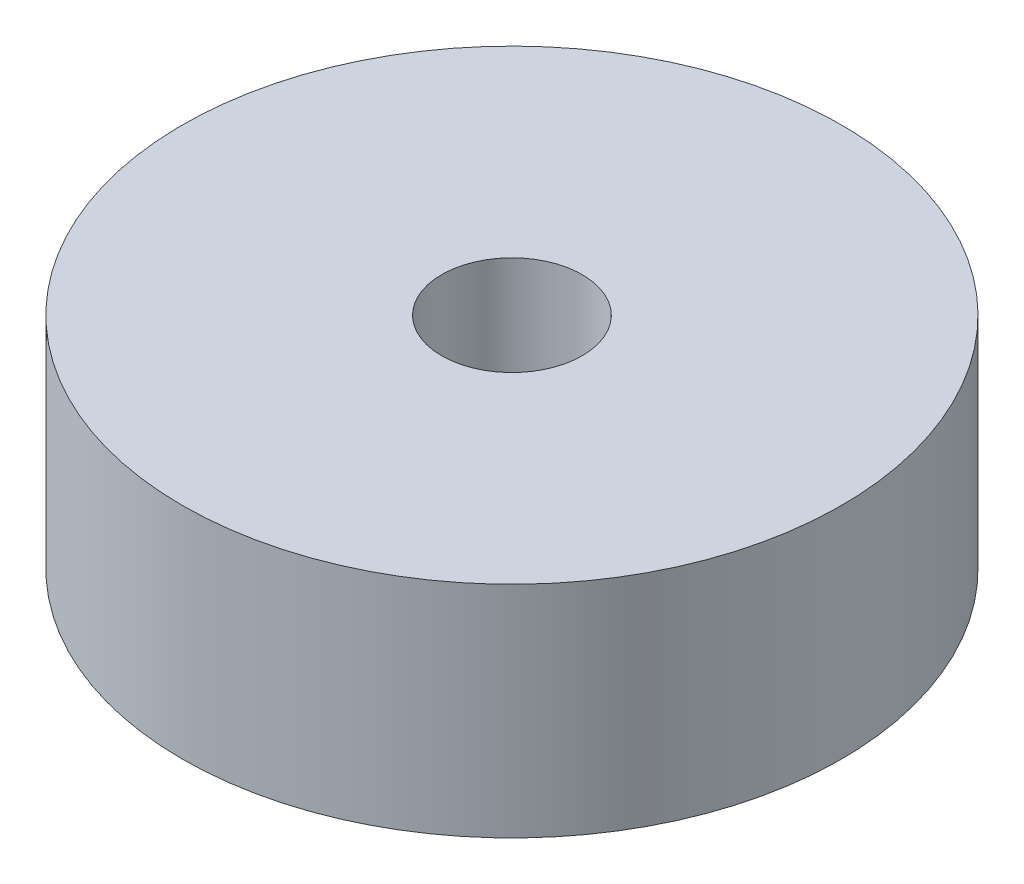
ISO-10303-21;
HEADER;
FILE_DESCRIPTION(('STEP AP214'),'2;1');
FILE_NAME('part.step','',(''),(''),'','','');
FILE_SCHEMA(('AUTOMOTIVE_DESIGN { 1 0 10303 214 1 1 1 1 }'));
ENDSEC;
DATA;
#1=APPLICATION_CONTEXT('core data for automotive mechanical design processes');
#2=APPLICATION_PROTOCOL_DEFINITION('international standard','automotive_design',2000,#1);
#3=PRODUCT_CONTEXT('',#1,'mechanical');
#4=PRODUCT('Part','Part','',(#3));
#5=PRODUCT_RELATED_PRODUCT_CATEGORY('part','',(#4));
#6=PRODUCT_DEFINITION_FORMATION('','',#4);
#7=PRODUCT_DEFINITION_CONTEXT('part definition',#1,'design');
#8=PRODUCT_DEFINITION('design','',#6,#7);
#9=PRODUCT_DEFINITION_SHAPE('','',#8);
#10=(LENGTH_UNIT() NAMED_UNIT(*) SI_UNIT(.MILLI.,.METRE.));
#11=(NAMED_UNIT(*) PLANE_ANGLE_UNIT() SI_UNIT($,.RADIAN.));
#12=(NAMED_UNIT(*) SI_UNIT($,.STERADIAN.) SOLID_ANGLE_UNIT());
#13=UNCERTAINTY_MEASURE_WITH_UNIT(LENGTH_MEASURE(1.E-05),#10,'distance_accuracy_value','');
#14=(GEOMETRIC_REPRESENTATION_CONTEXT(3) GLOBAL_UNCERTAINTY_ASSIGNED_CONTEXT((#13)) GLOBAL_UNIT_ASSIGNED_CONTEXT((#10,
#11,#12)) REPRESENTATION_CONTEXT('',''));
#15=CARTESIAN_POINT('',(0.,0.,0.));
#16=DIRECTION('',(0.,0.,1.));
#17=DIRECTION('',(1.,0.,0.));
#18=AXIS2_PLACEMENT_3D('',#15,#16,#17);
#19=CARTESIAN_POINT('',(0.,5.,0.));
#20=DIRECTION('',(0.,1.,0.));
#21=DIRECTION('',(0.,0.,1.));
#22=AXIS2_PLACEMENT_3D('',#19,#20,#21);
#23=PLANE('',#22);
#24=CARTESIAN_POINT('',(0.,5.,0.));
#25=DIRECTION('',(0.,1.,0.));
#26=DIRECTION('',(0.,0.,1.));
#27=AXIS2_PLACEMENT_3D('',#24,#25,#26);
#28=CIRCLE('',#27,7.5);
#29=CARTESIAN_POINT('',(0.,5.,7.5));
#30=VERTEX_POINT('',#29);
#31=EDGE_CURVE('E10',#30,#30,#28,.T.);
#32=ORIENTED_EDGE('',*,*,#31,.T.);
#33=EDGE_LOOP('',(#32));
#34=FACE_BOUND('',#33,.T.);
#35=CARTESIAN_POINT('',(0.,5.,0.));
#36=DIRECTION('',(0.,1.,0.));
#37=DIRECTION('',(0.,0.,1.));
#38=AXIS2_PLACEMENT_3D('',#35,#36,#37);
#39=CIRCLE('',#38,1.6);
#40=CARTESIAN_POINT('',(0.,5.,1.6));
#41=VERTEX_POINT('',#40);
#42=EDGE_CURVE('E44',#41,#41,#39,.T.);
#43=ORIENTED_EDGE('',*,*,#42,.F.);
#44=EDGE_LOOP('',(#43));
#45=FACE_BOUND('',#44,.T.);
#46=ADVANCED_FACE('F33',(#34,#45),#23,.T.);
#47=CARTESIAN_POINT('',(0.,0.,0.));
#48=DIRECTION('',(0.,1.,0.));
#49=DIRECTION('',(0.,0.,1.));
#50=AXIS2_PLACEMENT_3D('',#47,#48,#49);
#51=PLANE('',#50);
#52=CARTESIAN_POINT('',(0.,0.,0.));
#53=DIRECTION('',(0.,1.,0.));
#54=DIRECTION('',(0.,0.,1.));
#55=AXIS2_PLACEMENT_3D('',#52,#53,#54);
#56=CIRCLE('',#55,7.5);
#57=CARTESIAN_POINT('',(0.,0.,7.5));
#58=VERTEX_POINT('',#57);
#59=EDGE_CURVE('E37',#58,#58,#56,.T.);
#60=ORIENTED_EDGE('',*,*,#59,.F.);
#61=EDGE_LOOP('',(#60));
#62=FACE_BOUND('',#61,.T.);
#63=CARTESIAN_POINT('',(0.,0.,0.));
#64=DIRECTION('',(0.,1.,0.));
#65=DIRECTION('',(0.,0.,1.));
#66=AXIS2_PLACEMENT_3D('',#63,#64,#65);
#67=CIRCLE('',#66,1.6);
#68=CARTESIAN_POINT('',(0.,0.,1.6));
#69=VERTEX_POINT('',#68);
#70=EDGE_CURVE('E46',#69,#69,#67,.T.);
#71=ORIENTED_EDGE('',*,*,#70,.T.);
#72=EDGE_LOOP('',(#71));
#73=FACE_BOUND('',#72,.T.);
#74=ADVANCED_FACE('F56',(#62,#73),#51,.F.);
#75=CARTESIAN_POINT('',(0.,5.,0.));
#76=DIRECTION('',(0.,-1.,0.));
#77=DIRECTION('',(0.,0.,-1.));
#78=AXIS2_PLACEMENT_3D('',#75,#76,#77);
#79=CYLINDRICAL_SURFACE('',#78,7.5);
#80=ORIENTED_EDGE('',*,*,#31,.F.);
#81=EDGE_LOOP('',(#80));
#82=FACE_BOUND('',#81,.T.);
#83=ORIENTED_EDGE('',*,*,#59,.T.);
#84=EDGE_LOOP('',(#83));
#85=FACE_BOUND('',#84,.T.);
#86=ADVANCED_FACE('F35',(#82,#85),#79,.T.);
#87=CARTESIAN_POINT('',(0.,5.,0.));
#88=DIRECTION('',(0.,-1.,0.));
#89=DIRECTION('',(0.,0.,-1.));
#90=AXIS2_PLACEMENT_3D('',#87,#88,#89);
#91=CYLINDRICAL_SURFACE('',#90,1.6);
#92=ORIENTED_EDGE('',*,*,#42,.T.);
#93=EDGE_LOOP('',(#92));
#94=FACE_BOUND('',#93,.T.);
#95=ORIENTED_EDGE('',*,*,#70,.F.);
#96=EDGE_LOOP('',(#95));
#97=FACE_BOUND('',#96,.T.);
#98=ADVANCED_FACE('F52',(#94,#97),#91,.F.);
#99=CLOSED_SHELL('',(#46,#74,#86,#98));
#100=MANIFOLD_SOLID_BREP('B2',#99);
#101=ADVANCED_BREP_SHAPE_REPRESENTATION('',(#18,#100),#14);
#102=SHAPE_DEFINITION_REPRESENTATION(#9,#101);
ENDSEC;
END-ISO-10303-21;
